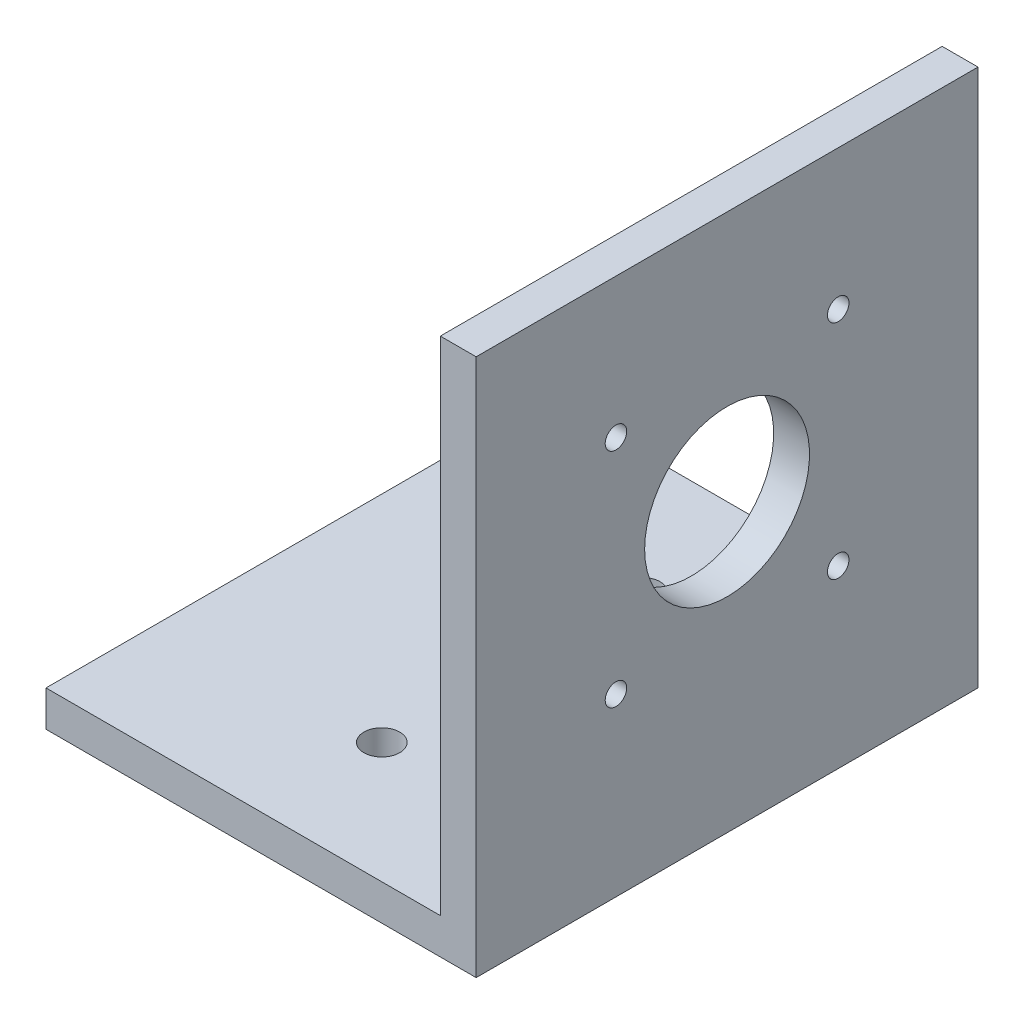
ISO-10303-21;
HEADER;
FILE_DESCRIPTION(('STEP AP214'),'2;1');
FILE_NAME('part.step','',(''),(''),'','','');
FILE_SCHEMA(('AUTOMOTIVE_DESIGN { 1 0 10303 214 1 1 1 1 }'));
ENDSEC;
DATA;
#1=APPLICATION_CONTEXT('core data for automotive mechanical design processes');
#2=APPLICATION_PROTOCOL_DEFINITION('international standard','automotive_design',2000,#1);
#3=PRODUCT_CONTEXT('',#1,'mechanical');
#4=PRODUCT('Part','Part','',(#3));
#5=PRODUCT_RELATED_PRODUCT_CATEGORY('part','',(#4));
#6=PRODUCT_DEFINITION_FORMATION('','',#4);
#7=PRODUCT_DEFINITION_CONTEXT('part definition',#1,'design');
#8=PRODUCT_DEFINITION('design','',#6,#7);
#9=PRODUCT_DEFINITION_SHAPE('','',#8);
#10=(LENGTH_UNIT() NAMED_UNIT(*) SI_UNIT(.MILLI.,.METRE.));
#11=(NAMED_UNIT(*) PLANE_ANGLE_UNIT() SI_UNIT($,.RADIAN.));
#12=(NAMED_UNIT(*) SI_UNIT($,.STERADIAN.) SOLID_ANGLE_UNIT());
#13=UNCERTAINTY_MEASURE_WITH_UNIT(LENGTH_MEASURE(1.E-05),#10,'distance_accuracy_value','');
#14=(GEOMETRIC_REPRESENTATION_CONTEXT(3) GLOBAL_UNCERTAINTY_ASSIGNED_CONTEXT((#13)) GLOBAL_UNIT_ASSIGNED_CONTEXT((#10,
#11,#12)) REPRESENTATION_CONTEXT('',''));
#15=CARTESIAN_POINT('',(0.,0.,0.));
#16=DIRECTION('',(0.,0.,1.));
#17=DIRECTION('',(1.,0.,0.));
#18=AXIS2_PLACEMENT_3D('',#15,#16,#17);
#19=CARTESIAN_POINT('',(0.,5.,0.));
#20=DIRECTION('',(0.,-1.,0.));
#21=DIRECTION('',(0.,0.,-1.));
#22=AXIS2_PLACEMENT_3D('',#19,#20,#21);
#23=PLANE('',#22);
#24=DIRECTION('',(0.,0.,1.));
#25=VECTOR('',#24,1.);
#26=CARTESIAN_POINT('',(25.,5.,-35.));
#27=LINE('',#26,#25);
#28=CARTESIAN_POINT('',(25.,5.,-35.));
#29=VERTEX_POINT('',#28);
#30=CARTESIAN_POINT('',(25.,5.,35.));
#31=VERTEX_POINT('',#30);
#32=EDGE_CURVE('E58',#29,#31,#27,.T.);
#33=ORIENTED_EDGE('',*,*,#32,.F.);
#34=DIRECTION('',(-1.,0.,0.));
#35=VECTOR('',#34,1.);
#36=CARTESIAN_POINT('',(-30.,5.,-35.));
#37=LINE('',#36,#35);
#38=CARTESIAN_POINT('',(-30.,5.,-35.));
#39=VERTEX_POINT('',#38);
#40=EDGE_CURVE('E96',#29,#39,#37,.T.);
#41=ORIENTED_EDGE('',*,*,#40,.T.);
#42=DIRECTION('',(0.,0.,1.));
#43=VECTOR('',#42,1.);
#44=CARTESIAN_POINT('',(-30.,5.,35.));
#45=LINE('',#44,#43);
#46=CARTESIAN_POINT('',(-30.,5.,35.));
#47=VERTEX_POINT('',#46);
#48=EDGE_CURVE('E64',#39,#47,#45,.T.);
#49=ORIENTED_EDGE('',*,*,#48,.T.);
#50=DIRECTION('',(1.,0.,0.));
#51=VECTOR('',#50,1.);
#52=CARTESIAN_POINT('',(-30.,5.,35.));
#53=LINE('',#52,#51);
#54=EDGE_CURVE('E107',#47,#31,#53,.T.);
#55=ORIENTED_EDGE('',*,*,#54,.T.);
#56=EDGE_LOOP('',(#33,#41,#49,#55));
#57=FACE_BOUND('',#56,.T.);
#58=CARTESIAN_POINT('',(0.,5.,18.1615129712014));
#59=DIRECTION('',(0.,-1.,0.));
#60=DIRECTION('',(0.,0.,-1.));
#61=AXIS2_PLACEMENT_3D('',#58,#59,#60);
#62=CIRCLE('',#61,2.5);
#63=CARTESIAN_POINT('',(0.,5.,15.6615129712014));
#64=VERTEX_POINT('',#63);
#65=EDGE_CURVE('E140',#64,#64,#62,.T.);
#66=ORIENTED_EDGE('',*,*,#65,.T.);
#67=EDGE_LOOP('',(#66));
#68=FACE_BOUND('',#67,.T.);
#69=CARTESIAN_POINT('',(0.,5.,-18.1615129712014));
#70=DIRECTION('',(0.,1.,0.));
#71=DIRECTION('',(0.,0.,1.));
#72=AXIS2_PLACEMENT_3D('',#69,#70,#71);
#73=CIRCLE('',#72,2.5);
#74=CARTESIAN_POINT('',(0.,5.,-15.6615129712014));
#75=VERTEX_POINT('',#74);
#76=EDGE_CURVE('E133',#75,#75,#73,.T.);
#77=ORIENTED_EDGE('',*,*,#76,.F.);
#78=EDGE_LOOP('',(#77));
#79=FACE_BOUND('',#78,.T.);
#80=ADVANCED_FACE('F40',(#57,#68,#79),#23,.F.);
#81=CARTESIAN_POINT('',(0.,0.,0.));
#82=DIRECTION('',(0.,-1.,0.));
#83=DIRECTION('',(0.,0.,-1.));
#84=AXIS2_PLACEMENT_3D('',#81,#82,#83);
#85=PLANE('',#84);
#86=CARTESIAN_POINT('',(0.,0.,18.1615129712014));
#87=DIRECTION('',(0.,-1.,0.));
#88=DIRECTION('',(0.,0.,-1.));
#89=AXIS2_PLACEMENT_3D('',#86,#87,#88);
#90=CIRCLE('',#89,2.5);
#91=CARTESIAN_POINT('',(0.,0.,15.6615129712014));
#92=VERTEX_POINT('',#91);
#93=EDGE_CURVE('E130',#92,#92,#90,.F.);
#94=ORIENTED_EDGE('',*,*,#93,.T.);
#95=EDGE_LOOP('',(#94));
#96=FACE_BOUND('',#95,.T.);
#97=DIRECTION('',(0.,0.,-1.));
#98=VECTOR('',#97,1.);
#99=CARTESIAN_POINT('',(30.,0.,35.));
#100=LINE('',#99,#98);
#101=CARTESIAN_POINT('',(30.,0.,35.));
#102=VERTEX_POINT('',#101);
#103=CARTESIAN_POINT('',(30.,0.,-35.));
#104=VERTEX_POINT('',#103);
#105=EDGE_CURVE('E103',#102,#104,#100,.T.);
#106=ORIENTED_EDGE('',*,*,#105,.F.);
#107=DIRECTION('',(1.,0.,0.));
#108=VECTOR('',#107,1.);
#109=CARTESIAN_POINT('',(-30.,0.,35.));
#110=LINE('',#109,#108);
#111=CARTESIAN_POINT('',(-30.,0.,35.));
#112=VERTEX_POINT('',#111);
#113=EDGE_CURVE('E84',#112,#102,#110,.T.);
#114=ORIENTED_EDGE('',*,*,#113,.F.);
#115=DIRECTION('',(0.,0.,1.));
#116=VECTOR('',#115,1.);
#117=CARTESIAN_POINT('',(-30.,0.,35.));
#118=LINE('',#117,#116);
#119=CARTESIAN_POINT('',(-30.,0.,-35.));
#120=VERTEX_POINT('',#119);
#121=EDGE_CURVE('E97',#120,#112,#118,.T.);
#122=ORIENTED_EDGE('',*,*,#121,.F.);
#123=DIRECTION('',(-1.,0.,0.));
#124=VECTOR('',#123,1.);
#125=CARTESIAN_POINT('',(-30.,0.,-35.));
#126=LINE('',#125,#124);
#127=EDGE_CURVE('E111',#104,#120,#126,.T.);
#128=ORIENTED_EDGE('',*,*,#127,.F.);
#129=EDGE_LOOP('',(#106,#114,#122,#128));
#130=FACE_BOUND('',#129,.T.);
#131=CARTESIAN_POINT('',(0.,0.,-18.1615129712014));
#132=DIRECTION('',(0.,-1.,0.));
#133=DIRECTION('',(0.,0.,-1.));
#134=AXIS2_PLACEMENT_3D('',#131,#132,#133);
#135=CIRCLE('',#134,2.5);
#136=CARTESIAN_POINT('',(0.,0.,-20.6615129712014));
#137=VERTEX_POINT('',#136);
#138=EDGE_CURVE('E44',#137,#137,#135,.T.);
#139=ORIENTED_EDGE('',*,*,#138,.F.);
#140=EDGE_LOOP('',(#139));
#141=FACE_BOUND('',#140,.T.);
#142=ADVANCED_FACE('F109',(#96,#130,#141),#85,.T.);
#143=CARTESIAN_POINT('',(30.,5.,35.));
#144=DIRECTION('',(-1.,0.,0.));
#145=DIRECTION('',(0.,0.,1.));
#146=AXIS2_PLACEMENT_3D('',#143,#144,#145);
#147=PLANE('',#146);
#148=CARTESIAN_POINT('',(30.,24.5,-15.5));
#149=DIRECTION('',(-1.,0.,0.));
#150=DIRECTION('',(0.,0.,1.));
#151=AXIS2_PLACEMENT_3D('',#148,#149,#150);
#152=CIRCLE('',#151,1.5);
#153=CARTESIAN_POINT('',(30.,24.5,-14.));
#154=VERTEX_POINT('',#153);
#155=EDGE_CURVE('E257',#154,#154,#152,.T.);
#156=ORIENTED_EDGE('',*,*,#155,.T.);
#157=EDGE_LOOP('',(#156));
#158=FACE_BOUND('',#157,.T.);
#159=CARTESIAN_POINT('',(30.,24.5,15.5));
#160=DIRECTION('',(-1.,0.,0.));
#161=DIRECTION('',(0.,0.,1.));
#162=AXIS2_PLACEMENT_3D('',#159,#160,#161);
#163=CIRCLE('',#162,1.5);
#164=CARTESIAN_POINT('',(30.,24.5,17.));
#165=VERTEX_POINT('',#164);
#166=EDGE_CURVE('E251',#165,#165,#163,.T.);
#167=ORIENTED_EDGE('',*,*,#166,.T.);
#168=EDGE_LOOP('',(#167));
#169=FACE_BOUND('',#168,.T.);
#170=CARTESIAN_POINT('',(30.,55.5,15.5));
#171=DIRECTION('',(-1.,0.,0.));
#172=DIRECTION('',(0.,0.,1.));
#173=AXIS2_PLACEMENT_3D('',#170,#171,#172);
#174=CIRCLE('',#173,1.5);
#175=CARTESIAN_POINT('',(30.,55.5,17.));
#176=VERTEX_POINT('',#175);
#177=EDGE_CURVE('E248',#176,#176,#174,.T.);
#178=ORIENTED_EDGE('',*,*,#177,.T.);
#179=EDGE_LOOP('',(#178));
#180=FACE_BOUND('',#179,.T.);
#181=CARTESIAN_POINT('',(30.,55.5,-15.5));
#182=DIRECTION('',(-1.,0.,0.));
#183=DIRECTION('',(0.,0.,1.));
#184=AXIS2_PLACEMENT_3D('',#181,#182,#183);
#185=CIRCLE('',#184,1.5);
#186=CARTESIAN_POINT('',(30.,55.5,-14.));
#187=VERTEX_POINT('',#186);
#188=EDGE_CURVE('E252',#187,#187,#185,.T.);
#189=ORIENTED_EDGE('',*,*,#188,.T.);
#190=EDGE_LOOP('',(#189));
#191=FACE_BOUND('',#190,.T.);
#192=CARTESIAN_POINT('',(30.,40.,0.));
#193=DIRECTION('',(-1.,0.,0.));
#194=DIRECTION('',(0.,0.,1.));
#195=AXIS2_PLACEMENT_3D('',#192,#193,#194);
#196=CIRCLE('',#195,11.5);
#197=CARTESIAN_POINT('',(30.,40.,11.5));
#198=VERTEX_POINT('',#197);
#199=EDGE_CURVE('E146',#198,#198,#196,.T.);
#200=ORIENTED_EDGE('',*,*,#199,.T.);
#201=EDGE_LOOP('',(#200));
#202=FACE_BOUND('',#201,.T.);
#203=ORIENTED_EDGE('',*,*,#105,.T.);
#204=DIRECTION('',(0.,-1.,0.));
#205=VECTOR('',#204,1.);
#206=CARTESIAN_POINT('',(30.,5.,-35.));
#207=LINE('',#206,#205);
#208=CARTESIAN_POINT('',(30.,75.,-35.));
#209=VERTEX_POINT('',#208);
#210=EDGE_CURVE('E11',#209,#104,#207,.T.);
#211=ORIENTED_EDGE('',*,*,#210,.F.);
#212=DIRECTION('',(0.,0.,-1.));
#213=VECTOR('',#212,1.);
#214=CARTESIAN_POINT('',(30.,75.,-35.));
#215=LINE('',#214,#213);
#216=CARTESIAN_POINT('',(30.,75.,35.));
#217=VERTEX_POINT('',#216);
#218=EDGE_CURVE('E105',#217,#209,#215,.T.);
#219=ORIENTED_EDGE('',*,*,#218,.F.);
#220=DIRECTION('',(0.,-1.,0.));
#221=VECTOR('',#220,1.);
#222=CARTESIAN_POINT('',(30.,5.,35.));
#223=LINE('',#222,#221);
#224=EDGE_CURVE('E88',#217,#102,#223,.T.);
#225=ORIENTED_EDGE('',*,*,#224,.T.);
#226=EDGE_LOOP('',(#203,#211,#219,#225));
#227=FACE_BOUND('',#226,.T.);
#228=ADVANCED_FACE('F42',(#158,#169,#180,#191,#202,#227),#147,.F.);
#229=CARTESIAN_POINT('',(-30.,5.,-35.));
#230=DIRECTION('',(0.,0.,1.));
#231=DIRECTION('',(1.,0.,0.));
#232=AXIS2_PLACEMENT_3D('',#229,#230,#231);
#233=PLANE('',#232);
#234=ORIENTED_EDGE('',*,*,#127,.T.);
#235=DIRECTION('',(0.,-1.,0.));
#236=VECTOR('',#235,1.);
#237=CARTESIAN_POINT('',(-30.,5.,-35.));
#238=LINE('',#237,#236);
#239=EDGE_CURVE('E50',#39,#120,#238,.T.);
#240=ORIENTED_EDGE('',*,*,#239,.F.);
#241=ORIENTED_EDGE('',*,*,#40,.F.);
#242=DIRECTION('',(0.,-1.,0.));
#243=VECTOR('',#242,1.);
#244=CARTESIAN_POINT('',(25.,75.,-35.));
#245=LINE('',#244,#243);
#246=CARTESIAN_POINT('',(25.,75.,-35.));
#247=VERTEX_POINT('',#246);
#248=EDGE_CURVE('E113',#247,#29,#245,.T.);
#249=ORIENTED_EDGE('',*,*,#248,.F.);
#250=DIRECTION('',(-1.,0.,0.));
#251=VECTOR('',#250,1.);
#252=CARTESIAN_POINT('',(30.,75.,-35.));
#253=LINE('',#252,#251);
#254=EDGE_CURVE('E153',#209,#247,#253,.T.);
#255=ORIENTED_EDGE('',*,*,#254,.F.);
#256=ORIENTED_EDGE('',*,*,#210,.T.);
#257=EDGE_LOOP('',(#234,#240,#241,#249,#255,#256));
#258=FACE_BOUND('',#257,.T.);
#259=ADVANCED_FACE('F190',(#258),#233,.F.);
#260=CARTESIAN_POINT('',(-30.,5.,35.));
#261=DIRECTION('',(1.,0.,0.));
#262=DIRECTION('',(0.,0.,-1.));
#263=AXIS2_PLACEMENT_3D('',#260,#261,#262);
#264=PLANE('',#263);
#265=ORIENTED_EDGE('',*,*,#121,.T.);
#266=DIRECTION('',(0.,-1.,0.));
#267=VECTOR('',#266,1.);
#268=CARTESIAN_POINT('',(-30.,5.,35.));
#269=LINE('',#268,#267);
#270=EDGE_CURVE('E91',#47,#112,#269,.T.);
#271=ORIENTED_EDGE('',*,*,#270,.F.);
#272=ORIENTED_EDGE('',*,*,#48,.F.);
#273=ORIENTED_EDGE('',*,*,#239,.T.);
#274=EDGE_LOOP('',(#265,#271,#272,#273));
#275=FACE_BOUND('',#274,.T.);
#276=ADVANCED_FACE('F193',(#275),#264,.F.);
#277=CARTESIAN_POINT('',(-30.,5.,35.));
#278=DIRECTION('',(0.,0.,-1.));
#279=DIRECTION('',(-1.,0.,0.));
#280=AXIS2_PLACEMENT_3D('',#277,#278,#279);
#281=PLANE('',#280);
#282=ORIENTED_EDGE('',*,*,#113,.T.);
#283=ORIENTED_EDGE('',*,*,#224,.F.);
#284=DIRECTION('',(1.,0.,0.));
#285=VECTOR('',#284,1.);
#286=CARTESIAN_POINT('',(30.,75.,35.));
#287=LINE('',#286,#285);
#288=CARTESIAN_POINT('',(25.,75.,35.));
#289=VERTEX_POINT('',#288);
#290=EDGE_CURVE('E161',#289,#217,#287,.T.);
#291=ORIENTED_EDGE('',*,*,#290,.F.);
#292=DIRECTION('',(0.,-1.,0.));
#293=VECTOR('',#292,1.);
#294=CARTESIAN_POINT('',(25.,75.,35.));
#295=LINE('',#294,#293);
#296=EDGE_CURVE('E119',#289,#31,#295,.T.);
#297=ORIENTED_EDGE('',*,*,#296,.T.);
#298=ORIENTED_EDGE('',*,*,#54,.F.);
#299=ORIENTED_EDGE('',*,*,#270,.T.);
#300=EDGE_LOOP('',(#282,#283,#291,#297,#298,#299));
#301=FACE_BOUND('',#300,.T.);
#302=ADVANCED_FACE('F86',(#301),#281,.F.);
#303=CARTESIAN_POINT('',(25.,75.,-35.));
#304=DIRECTION('',(1.,0.,0.));
#305=DIRECTION('',(0.,0.,-1.));
#306=AXIS2_PLACEMENT_3D('',#303,#304,#305);
#307=PLANE('',#306);
#308=CARTESIAN_POINT('',(25.,24.5,-15.5));
#309=DIRECTION('',(-1.,0.,0.));
#310=DIRECTION('',(0.,0.,1.));
#311=AXIS2_PLACEMENT_3D('',#308,#309,#310);
#312=CIRCLE('',#311,1.5);
#313=CARTESIAN_POINT('',(25.,24.5,-14.));
#314=VERTEX_POINT('',#313);
#315=EDGE_CURVE('E382',#314,#314,#312,.T.);
#316=ORIENTED_EDGE('',*,*,#315,.F.);
#317=EDGE_LOOP('',(#316));
#318=FACE_BOUND('',#317,.T.);
#319=CARTESIAN_POINT('',(25.,24.5,15.5));
#320=DIRECTION('',(-1.,0.,0.));
#321=DIRECTION('',(0.,0.,1.));
#322=AXIS2_PLACEMENT_3D('',#319,#320,#321);
#323=CIRCLE('',#322,1.5);
#324=CARTESIAN_POINT('',(25.,24.5,17.));
#325=VERTEX_POINT('',#324);
#326=EDGE_CURVE('E386',#325,#325,#323,.T.);
#327=ORIENTED_EDGE('',*,*,#326,.F.);
#328=EDGE_LOOP('',(#327));
#329=FACE_BOUND('',#328,.T.);
#330=CARTESIAN_POINT('',(25.,55.5,15.5));
#331=DIRECTION('',(-1.,0.,0.));
#332=DIRECTION('',(0.,0.,1.));
#333=AXIS2_PLACEMENT_3D('',#330,#331,#332);
#334=CIRCLE('',#333,1.5);
#335=CARTESIAN_POINT('',(25.,55.5,17.));
#336=VERTEX_POINT('',#335);
#337=EDGE_CURVE('E245',#336,#336,#334,.T.);
#338=ORIENTED_EDGE('',*,*,#337,.F.);
#339=EDGE_LOOP('',(#338));
#340=FACE_BOUND('',#339,.T.);
#341=CARTESIAN_POINT('',(25.,55.5,-15.5));
#342=DIRECTION('',(-1.,0.,0.));
#343=DIRECTION('',(0.,0.,1.));
#344=AXIS2_PLACEMENT_3D('',#341,#342,#343);
#345=CIRCLE('',#344,1.5);
#346=CARTESIAN_POINT('',(25.,55.5,-14.));
#347=VERTEX_POINT('',#346);
#348=EDGE_CURVE('E260',#347,#347,#345,.T.);
#349=ORIENTED_EDGE('',*,*,#348,.F.);
#350=EDGE_LOOP('',(#349));
#351=FACE_BOUND('',#350,.T.);
#352=CARTESIAN_POINT('',(25.,40.,0.));
#353=DIRECTION('',(-1.,0.,0.));
#354=DIRECTION('',(0.,0.,1.));
#355=AXIS2_PLACEMENT_3D('',#352,#353,#354);
#356=CIRCLE('',#355,11.5);
#357=CARTESIAN_POINT('',(25.,40.,11.5));
#358=VERTEX_POINT('',#357);
#359=EDGE_CURVE('E266',#358,#358,#356,.T.);
#360=ORIENTED_EDGE('',*,*,#359,.F.);
#361=EDGE_LOOP('',(#360));
#362=FACE_BOUND('',#361,.T.);
#363=ORIENTED_EDGE('',*,*,#32,.T.);
#364=ORIENTED_EDGE('',*,*,#296,.F.);
#365=DIRECTION('',(0.,0.,1.));
#366=VECTOR('',#365,1.);
#367=CARTESIAN_POINT('',(25.,75.,-35.));
#368=LINE('',#367,#366);
#369=EDGE_CURVE('E157',#247,#289,#368,.T.);
#370=ORIENTED_EDGE('',*,*,#369,.F.);
#371=ORIENTED_EDGE('',*,*,#248,.T.);
#372=EDGE_LOOP('',(#363,#364,#370,#371));
#373=FACE_BOUND('',#372,.T.);
#374=ADVANCED_FACE('F177',(#318,#329,#340,#351,#362,#373),#307,.F.);
#375=CARTESIAN_POINT('',(0.,75.,0.));
#376=DIRECTION('',(0.,-1.,0.));
#377=DIRECTION('',(0.,0.,-1.));
#378=AXIS2_PLACEMENT_3D('',#375,#376,#377);
#379=PLANE('',#378);
#380=ORIENTED_EDGE('',*,*,#218,.T.);
#381=ORIENTED_EDGE('',*,*,#254,.T.);
#382=ORIENTED_EDGE('',*,*,#369,.T.);
#383=ORIENTED_EDGE('',*,*,#290,.T.);
#384=EDGE_LOOP('',(#380,#381,#382,#383));
#385=FACE_BOUND('',#384,.T.);
#386=ADVANCED_FACE('F184',(#385),#379,.F.);
#387=CARTESIAN_POINT('',(0.,-65.,18.1615129712014));
#388=DIRECTION('',(0.,1.,0.));
#389=DIRECTION('',(0.,0.,1.));
#390=AXIS2_PLACEMENT_3D('',#387,#388,#389);
#391=CYLINDRICAL_SURFACE('',#390,2.5);
#392=ORIENTED_EDGE('',*,*,#93,.F.);
#393=EDGE_LOOP('',(#392));
#394=FACE_BOUND('',#393,.T.);
#395=ORIENTED_EDGE('',*,*,#65,.F.);
#396=EDGE_LOOP('',(#395));
#397=FACE_BOUND('',#396,.T.);
#398=ADVANCED_FACE('F213',(#394,#397),#391,.F.);
#399=CARTESIAN_POINT('',(0.,-65.,-18.1615129712014));
#400=DIRECTION('',(0.,1.,0.));
#401=DIRECTION('',(0.,0.,1.));
#402=AXIS2_PLACEMENT_3D('',#399,#400,#401);
#403=CYLINDRICAL_SURFACE('',#402,2.5);
#404=ORIENTED_EDGE('',*,*,#138,.T.);
#405=EDGE_LOOP('',(#404));
#406=FACE_BOUND('',#405,.T.);
#407=ORIENTED_EDGE('',*,*,#76,.T.);
#408=EDGE_LOOP('',(#407));
#409=FACE_BOUND('',#408,.T.);
#410=ADVANCED_FACE('F216',(#406,#409),#403,.F.);
#411=CARTESIAN_POINT('',(35.,40.,0.));
#412=DIRECTION('',(-1.,0.,0.));
#413=DIRECTION('',(0.,0.,1.));
#414=AXIS2_PLACEMENT_3D('',#411,#412,#413);
#415=CYLINDRICAL_SURFACE('',#414,11.5);
#416=ORIENTED_EDGE('',*,*,#359,.T.);
#417=EDGE_LOOP('',(#416));
#418=FACE_BOUND('',#417,.T.);
#419=ORIENTED_EDGE('',*,*,#199,.F.);
#420=EDGE_LOOP('',(#419));
#421=FACE_BOUND('',#420,.T.);
#422=ADVANCED_FACE('F220',(#418,#421),#415,.F.);
#423=CARTESIAN_POINT('',(35.,55.5,-15.5));
#424=DIRECTION('',(-1.,0.,0.));
#425=DIRECTION('',(0.,0.,1.));
#426=AXIS2_PLACEMENT_3D('',#423,#424,#425);
#427=CYLINDRICAL_SURFACE('',#426,1.5);
#428=ORIENTED_EDGE('',*,*,#348,.T.);
#429=EDGE_LOOP('',(#428));
#430=FACE_BOUND('',#429,.T.);
#431=ORIENTED_EDGE('',*,*,#188,.F.);
#432=EDGE_LOOP('',(#431));
#433=FACE_BOUND('',#432,.T.);
#434=ADVANCED_FACE('F224',(#430,#433),#427,.F.);
#435=CARTESIAN_POINT('',(35.,55.5,15.5));
#436=DIRECTION('',(-1.,0.,0.));
#437=DIRECTION('',(0.,0.,1.));
#438=AXIS2_PLACEMENT_3D('',#435,#436,#437);
#439=CYLINDRICAL_SURFACE('',#438,1.5);
#440=ORIENTED_EDGE('',*,*,#337,.T.);
#441=EDGE_LOOP('',(#440));
#442=FACE_BOUND('',#441,.T.);
#443=ORIENTED_EDGE('',*,*,#177,.F.);
#444=EDGE_LOOP('',(#443));
#445=FACE_BOUND('',#444,.T.);
#446=ADVANCED_FACE('F228',(#442,#445),#439,.F.);
#447=CARTESIAN_POINT('',(35.,24.5,15.5));
#448=DIRECTION('',(-1.,0.,0.));
#449=DIRECTION('',(0.,0.,1.));
#450=AXIS2_PLACEMENT_3D('',#447,#448,#449);
#451=CYLINDRICAL_SURFACE('',#450,1.5);
#452=ORIENTED_EDGE('',*,*,#326,.T.);
#453=EDGE_LOOP('',(#452));
#454=FACE_BOUND('',#453,.T.);
#455=ORIENTED_EDGE('',*,*,#166,.F.);
#456=EDGE_LOOP('',(#455));
#457=FACE_BOUND('',#456,.T.);
#458=ADVANCED_FACE('F233',(#454,#457),#451,.F.);
#459=CARTESIAN_POINT('',(35.,24.5,-15.5));
#460=DIRECTION('',(-1.,0.,0.));
#461=DIRECTION('',(0.,0.,1.));
#462=AXIS2_PLACEMENT_3D('',#459,#460,#461);
#463=CYLINDRICAL_SURFACE('',#462,1.5);
#464=ORIENTED_EDGE('',*,*,#315,.T.);
#465=EDGE_LOOP('',(#464));
#466=FACE_BOUND('',#465,.T.);
#467=ORIENTED_EDGE('',*,*,#155,.F.);
#468=EDGE_LOOP('',(#467));
#469=FACE_BOUND('',#468,.T.);
#470=ADVANCED_FACE('F230',(#466,#469),#463,.F.);
#471=CLOSED_SHELL('',(#80,#142,#228,#259,#276,#302,#374,#386,#398,#410,#422,#434,#446,#458,#470));
#472=MANIFOLD_SOLID_BREP('B2',#471);
#473=ADVANCED_BREP_SHAPE_REPRESENTATION('',(#18,#472),#14);
#474=SHAPE_DEFINITION_REPRESENTATION(#9,#473);
ENDSEC;
END-ISO-10303-21;
